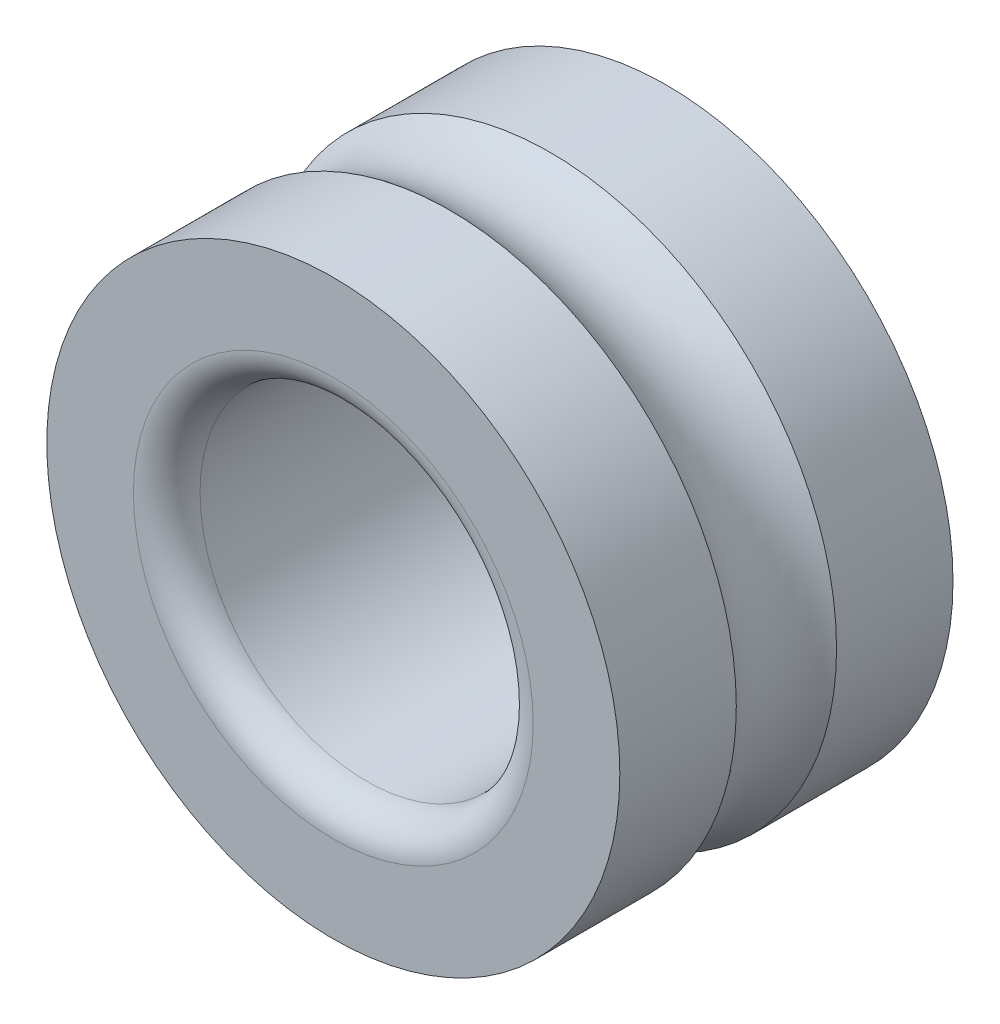
ISO-10303-21;
HEADER;
FILE_DESCRIPTION(('STEP AP214'),'2;1');
FILE_NAME('part.step','',(''),(''),'','','');
FILE_SCHEMA(('AUTOMOTIVE_DESIGN { 1 0 10303 214 1 1 1 1 }'));
ENDSEC;
DATA;
#1=APPLICATION_CONTEXT('core data for automotive mechanical design processes');
#2=APPLICATION_PROTOCOL_DEFINITION('international standard','automotive_design',2000,#1);
#3=PRODUCT_CONTEXT('',#1,'mechanical');
#4=PRODUCT('Part','Part','',(#3));
#5=PRODUCT_RELATED_PRODUCT_CATEGORY('part','',(#4));
#6=PRODUCT_DEFINITION_FORMATION('','',#4);
#7=PRODUCT_DEFINITION_CONTEXT('part definition',#1,'design');
#8=PRODUCT_DEFINITION('design','',#6,#7);
#9=PRODUCT_DEFINITION_SHAPE('','',#8);
#10=(LENGTH_UNIT() NAMED_UNIT(*) SI_UNIT(.MILLI.,.METRE.));
#11=(NAMED_UNIT(*) PLANE_ANGLE_UNIT() SI_UNIT($,.RADIAN.));
#12=(NAMED_UNIT(*) SI_UNIT($,.STERADIAN.) SOLID_ANGLE_UNIT());
#13=UNCERTAINTY_MEASURE_WITH_UNIT(LENGTH_MEASURE(1.E-05),#10,'distance_accuracy_value','');
#14=(GEOMETRIC_REPRESENTATION_CONTEXT(3) GLOBAL_UNCERTAINTY_ASSIGNED_CONTEXT((#13)) GLOBAL_UNIT_ASSIGNED_CONTEXT((#10,
#11,#12)) REPRESENTATION_CONTEXT('',''));
#15=CARTESIAN_POINT('',(0.,0.,0.));
#16=DIRECTION('',(0.,0.,1.));
#17=DIRECTION('',(1.,0.,0.));
#18=AXIS2_PLACEMENT_3D('',#15,#16,#17);
#19=CARTESIAN_POINT('',(0.,0.,0.));
#20=DIRECTION('',(0.,0.,1.));
#21=DIRECTION('',(1.,0.,0.));
#22=AXIS2_PLACEMENT_3D('',#19,#20,#21);
#23=TOROIDAL_SURFACE('',#22,5.25,1.21175743903915);
#24=CARTESIAN_POINT('',(0.,0.,-0.752234066675205));
#25=DIRECTION('',(0.,0.,1.));
#26=DIRECTION('',(1.,0.,0.));
#27=AXIS2_PLACEMENT_3D('',#24,#25,#26);
#28=CIRCLE('',#27,4.3);
#29=CARTESIAN_POINT('',(4.3,0.,-0.752234066675205));
#30=VERTEX_POINT('',#29);
#31=EDGE_CURVE('E115',#30,#30,#28,.F.);
#32=ORIENTED_EDGE('',*,*,#31,.F.);
#33=EDGE_LOOP('',(#32));
#34=FACE_BOUND('',#33,.T.);
#35=CARTESIAN_POINT('',(0.,0.,0.752234066675204));
#36=DIRECTION('',(0.,0.,1.));
#37=DIRECTION('',(1.,0.,0.));
#38=AXIS2_PLACEMENT_3D('',#35,#36,#37);
#39=CIRCLE('',#38,4.3);
#40=CARTESIAN_POINT('',(4.3,0.,0.752234066675204));
#41=VERTEX_POINT('',#40);
#42=EDGE_CURVE('E112',#41,#41,#39,.T.);
#43=ORIENTED_EDGE('',*,*,#42,.F.);
#44=EDGE_LOOP('',(#43));
#45=FACE_BOUND('',#44,.T.);
#46=ADVANCED_FACE('F15',(#34,#45),#23,.F.);
#47=CARTESIAN_POINT('',(0.,0.,2.5));
#48=DIRECTION('',(0.,0.,1.));
#49=DIRECTION('',(1.,0.,0.));
#50=AXIS2_PLACEMENT_3D('',#47,#48,#49);
#51=CYLINDRICAL_SURFACE('',#50,4.3);
#52=CARTESIAN_POINT('',(0.,0.,-2.5));
#53=DIRECTION('',(0.,0.,1.));
#54=DIRECTION('',(1.,0.,0.));
#55=AXIS2_PLACEMENT_3D('',#52,#53,#54);
#56=CIRCLE('',#55,4.3);
#57=CARTESIAN_POINT('',(4.3,0.,-2.5));
#58=VERTEX_POINT('',#57);
#59=EDGE_CURVE('E19',#58,#58,#56,.T.);
#60=ORIENTED_EDGE('',*,*,#59,.T.);
#61=EDGE_LOOP('',(#60));
#62=FACE_BOUND('',#61,.T.);
#63=ORIENTED_EDGE('',*,*,#31,.T.);
#64=EDGE_LOOP('',(#63));
#65=FACE_BOUND('',#64,.T.);
#66=ADVANCED_FACE('F81',(#62,#65),#51,.T.);
#67=CARTESIAN_POINT('',(0.,0.,2.5));
#68=DIRECTION('',(0.,0.,1.));
#69=DIRECTION('',(1.,0.,0.));
#70=AXIS2_PLACEMENT_3D('',#67,#68,#69);
#71=CYLINDRICAL_SURFACE('',#70,4.3);
#72=ORIENTED_EDGE('',*,*,#42,.T.);
#73=EDGE_LOOP('',(#72));
#74=FACE_BOUND('',#73,.T.);
#75=CARTESIAN_POINT('',(0.,0.,2.5));
#76=DIRECTION('',(0.,0.,1.));
#77=DIRECTION('',(1.,0.,0.));
#78=AXIS2_PLACEMENT_3D('',#75,#76,#77);
#79=CIRCLE('',#78,4.3);
#80=CARTESIAN_POINT('',(4.3,0.,2.5));
#81=VERTEX_POINT('',#80);
#82=EDGE_CURVE('E108',#81,#81,#79,.F.);
#83=ORIENTED_EDGE('',*,*,#82,.T.);
#84=EDGE_LOOP('',(#83));
#85=FACE_BOUND('',#84,.T.);
#86=ADVANCED_FACE('F78',(#74,#85),#71,.T.);
#87=CARTESIAN_POINT('',(0.,2.75,-2.5));
#88=DIRECTION('',(0.,0.,1.));
#89=DIRECTION('',(1.,0.,0.));
#90=AXIS2_PLACEMENT_3D('',#87,#88,#89);
#91=PLANE('',#90);
#92=CARTESIAN_POINT('',(0.,0.,-2.5));
#93=DIRECTION('',(0.,0.,-1.));
#94=DIRECTION('',(1.,0.,0.));
#95=AXIS2_PLACEMENT_3D('',#92,#93,#94);
#96=CIRCLE('',#95,3.);
#97=CARTESIAN_POINT('',(3.,0.,-2.5));
#98=VERTEX_POINT('',#97);
#99=EDGE_CURVE('E62',#98,#98,#96,.T.);
#100=ORIENTED_EDGE('',*,*,#99,.F.);
#101=EDGE_LOOP('',(#100));
#102=FACE_BOUND('',#101,.T.);
#103=ORIENTED_EDGE('',*,*,#59,.F.);
#104=EDGE_LOOP('',(#103));
#105=FACE_BOUND('',#104,.T.);
#106=ADVANCED_FACE('F68',(#102,#105),#91,.F.);
#107=CARTESIAN_POINT('',(0.,4.76648351648352,2.5));
#108=DIRECTION('',(0.,0.,-1.));
#109=DIRECTION('',(-1.,0.,0.));
#110=AXIS2_PLACEMENT_3D('',#107,#108,#109);
#111=PLANE('',#110);
#112=CARTESIAN_POINT('',(0.,0.,2.5));
#113=DIRECTION('',(0.,0.,1.));
#114=DIRECTION('',(-1.,0.,0.));
#115=AXIS2_PLACEMENT_3D('',#112,#113,#114);
#116=CIRCLE('',#115,3.);
#117=CARTESIAN_POINT('',(-3.,0.,2.5));
#118=VERTEX_POINT('',#117);
#119=EDGE_CURVE('E28',#118,#118,#116,.T.);
#120=ORIENTED_EDGE('',*,*,#119,.F.);
#121=EDGE_LOOP('',(#120));
#122=FACE_BOUND('',#121,.T.);
#123=ORIENTED_EDGE('',*,*,#82,.F.);
#124=EDGE_LOOP('',(#123));
#125=FACE_BOUND('',#124,.T.);
#126=ADVANCED_FACE('F77',(#122,#125),#111,.F.);
#127=CARTESIAN_POINT('',(0.,0.,-2.));
#128=DIRECTION('',(0.,0.,-1.));
#129=DIRECTION('',(-1.,0.,0.));
#130=AXIS2_PLACEMENT_3D('',#127,#128,#129);
#131=TOROIDAL_SURFACE('',#130,3.,0.5);
#132=ORIENTED_EDGE('',*,*,#99,.T.);
#133=EDGE_LOOP('',(#132));
#134=FACE_BOUND('',#133,.T.);
#135=CARTESIAN_POINT('',(0.,0.,-2.));
#136=DIRECTION('',(0.,0.,1.));
#137=DIRECTION('',(1.,0.,0.));
#138=AXIS2_PLACEMENT_3D('',#135,#136,#137);
#139=CIRCLE('',#138,2.5);
#140=CARTESIAN_POINT('',(2.5,0.,-2.));
#141=VERTEX_POINT('',#140);
#142=EDGE_CURVE('E23',#141,#141,#139,.T.);
#143=ORIENTED_EDGE('',*,*,#142,.T.);
#144=EDGE_LOOP('',(#143));
#145=FACE_BOUND('',#144,.T.);
#146=ADVANCED_FACE('F42',(#134,#145),#131,.T.);
#147=CARTESIAN_POINT('',(0.,0.,2.));
#148=DIRECTION('',(0.,0.,1.));
#149=DIRECTION('',(1.,0.,0.));
#150=AXIS2_PLACEMENT_3D('',#147,#148,#149);
#151=TOROIDAL_SURFACE('',#150,3.,0.5);
#152=ORIENTED_EDGE('',*,*,#119,.T.);
#153=EDGE_LOOP('',(#152));
#154=FACE_BOUND('',#153,.T.);
#155=CARTESIAN_POINT('',(0.,0.,2.));
#156=DIRECTION('',(0.,0.,1.));
#157=DIRECTION('',(1.,0.,0.));
#158=AXIS2_PLACEMENT_3D('',#155,#156,#157);
#159=CIRCLE('',#158,2.5);
#160=CARTESIAN_POINT('',(2.5,0.,2.));
#161=VERTEX_POINT('',#160);
#162=EDGE_CURVE('E10',#161,#161,#159,.F.);
#163=ORIENTED_EDGE('',*,*,#162,.T.);
#164=EDGE_LOOP('',(#163));
#165=FACE_BOUND('',#164,.T.);
#166=ADVANCED_FACE('F36',(#154,#165),#151,.T.);
#167=CARTESIAN_POINT('',(0.,0.,2.5));
#168=DIRECTION('',(0.,0.,1.));
#169=DIRECTION('',(1.,0.,0.));
#170=AXIS2_PLACEMENT_3D('',#167,#168,#169);
#171=CYLINDRICAL_SURFACE('',#170,2.5);
#172=ORIENTED_EDGE('',*,*,#162,.F.);
#173=EDGE_LOOP('',(#172));
#174=FACE_BOUND('',#173,.T.);
#175=ORIENTED_EDGE('',*,*,#142,.F.);
#176=EDGE_LOOP('',(#175));
#177=FACE_BOUND('',#176,.T.);
#178=ADVANCED_FACE('F41',(#174,#177),#171,.F.);
#179=CLOSED_SHELL('',(#46,#66,#86,#106,#126,#146,#166,#178));
#180=MANIFOLD_SOLID_BREP('B1',#179);
#181=ADVANCED_BREP_SHAPE_REPRESENTATION('',(#18,#180),#14);
#182=SHAPE_DEFINITION_REPRESENTATION(#9,#181);
ENDSEC;
END-ISO-10303-21;
